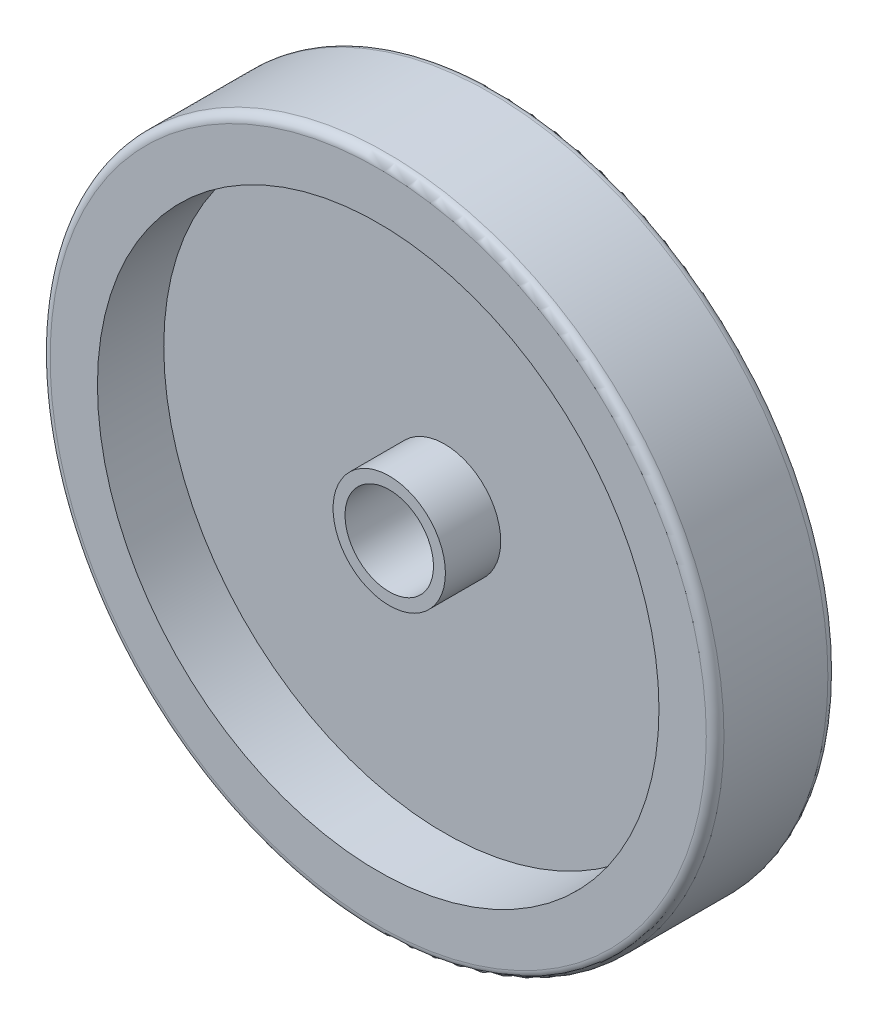
ISO-10303-21;
HEADER;
FILE_DESCRIPTION(('STEP AP214'),'2;1');
FILE_NAME('part.step','',(''),(''),'','','');
FILE_SCHEMA(('AUTOMOTIVE_DESIGN { 1 0 10303 214 1 1 1 1 }'));
ENDSEC;
DATA;
#1=APPLICATION_CONTEXT('core data for automotive mechanical design processes');
#2=APPLICATION_PROTOCOL_DEFINITION('international standard','automotive_design',2000,#1);
#3=PRODUCT_CONTEXT('',#1,'mechanical');
#4=PRODUCT('Part','Part','',(#3));
#5=PRODUCT_RELATED_PRODUCT_CATEGORY('part','',(#4));
#6=PRODUCT_DEFINITION_FORMATION('','',#4);
#7=PRODUCT_DEFINITION_CONTEXT('part definition',#1,'design');
#8=PRODUCT_DEFINITION('design','',#6,#7);
#9=PRODUCT_DEFINITION_SHAPE('','',#8);
#10=(LENGTH_UNIT() NAMED_UNIT(*) SI_UNIT(.MILLI.,.METRE.));
#11=(NAMED_UNIT(*) PLANE_ANGLE_UNIT() SI_UNIT($,.RADIAN.));
#12=(NAMED_UNIT(*) SI_UNIT($,.STERADIAN.) SOLID_ANGLE_UNIT());
#13=UNCERTAINTY_MEASURE_WITH_UNIT(LENGTH_MEASURE(1.E-05),#10,'distance_accuracy_value','');
#14=(GEOMETRIC_REPRESENTATION_CONTEXT(3) GLOBAL_UNCERTAINTY_ASSIGNED_CONTEXT((#13)) GLOBAL_UNIT_ASSIGNED_CONTEXT((#10,
#11,#12)) REPRESENTATION_CONTEXT('',''));
#15=CARTESIAN_POINT('',(0.,0.,0.));
#16=DIRECTION('',(0.,0.,1.));
#17=DIRECTION('',(1.,0.,0.));
#18=AXIS2_PLACEMENT_3D('',#15,#16,#17);
#19=CARTESIAN_POINT('',(0.,0.,12.5));
#20=DIRECTION('',(0.,0.,1.));
#21=DIRECTION('',(1.,0.,0.));
#22=AXIS2_PLACEMENT_3D('',#19,#20,#21);
#23=PLANE('',#22);
#24=CARTESIAN_POINT('',(0.,0.,12.5));
#25=DIRECTION('',(0.,0.,1.));
#26=DIRECTION('',(1.,0.,0.));
#27=AXIS2_PLACEMENT_3D('',#24,#25,#26);
#28=CIRCLE('',#27,12.7);
#29=CARTESIAN_POINT('',(12.7,0.,12.5));
#30=VERTEX_POINT('',#29);
#31=EDGE_CURVE('E75',#30,#30,#28,.T.);
#32=ORIENTED_EDGE('',*,*,#31,.F.);
#33=EDGE_LOOP('',(#32));
#34=FACE_BOUND('',#33,.T.);
#35=CARTESIAN_POINT('',(0.,0.,12.5));
#36=DIRECTION('',(0.,0.,1.));
#37=DIRECTION('',(1.,0.,0.));
#38=AXIS2_PLACEMENT_3D('',#35,#36,#37);
#39=CIRCLE('',#38,63.5);
#40=CARTESIAN_POINT('',(63.5,0.,12.5));
#41=VERTEX_POINT('',#40);
#42=EDGE_CURVE('E65',#41,#41,#39,.F.);
#43=ORIENTED_EDGE('',*,*,#42,.F.);
#44=EDGE_LOOP('',(#43));
#45=FACE_BOUND('',#44,.T.);
#46=ADVANCED_FACE('F41',(#34,#45),#23,.T.);
#47=CARTESIAN_POINT('',(0.,0.,25.));
#48=DIRECTION('',(0.,0.,-1.));
#49=DIRECTION('',(-1.,0.,0.));
#50=AXIS2_PLACEMENT_3D('',#47,#48,#49);
#51=CYLINDRICAL_SURFACE('',#50,76.2);
#52=CARTESIAN_POINT('',(0.,0.,25.5));
#53=DIRECTION('',(0.,0.,1.));
#54=DIRECTION('',(1.,0.,0.));
#55=AXIS2_PLACEMENT_3D('',#52,#53,#54);
#56=CIRCLE('',#55,76.2);
#57=CARTESIAN_POINT('',(76.2,0.,25.5));
#58=VERTEX_POINT('',#57);
#59=EDGE_CURVE('E49',#58,#58,#56,.F.);
#60=ORIENTED_EDGE('',*,*,#59,.T.);
#61=EDGE_LOOP('',(#60));
#62=FACE_BOUND('',#61,.T.);
#63=CARTESIAN_POINT('',(0.,0.,2.));
#64=DIRECTION('',(0.,0.,1.));
#65=DIRECTION('',(1.,0.,0.));
#66=AXIS2_PLACEMENT_3D('',#63,#64,#65);
#67=CIRCLE('',#66,76.2);
#68=CARTESIAN_POINT('',(76.2,0.,2.));
#69=VERTEX_POINT('',#68);
#70=EDGE_CURVE('E54',#69,#69,#67,.T.);
#71=ORIENTED_EDGE('',*,*,#70,.T.);
#72=EDGE_LOOP('',(#71));
#73=FACE_BOUND('',#72,.T.);
#74=ADVANCED_FACE('F109',(#62,#73),#51,.T.);
#75=CARTESIAN_POINT('',(0.,0.,25.));
#76=DIRECTION('',(0.,0.,1.));
#77=DIRECTION('',(1.,0.,0.));
#78=AXIS2_PLACEMENT_3D('',#75,#76,#77);
#79=PLANE('',#78);
#80=CARTESIAN_POINT('',(0.,0.,25.));
#81=DIRECTION('',(0.,0.,1.));
#82=DIRECTION('',(1.,0.,0.));
#83=AXIS2_PLACEMENT_3D('',#80,#81,#82);
#84=CIRCLE('',#83,10.);
#85=CARTESIAN_POINT('',(10.,0.,25.));
#86=VERTEX_POINT('',#85);
#87=EDGE_CURVE('E69',#86,#86,#84,.T.);
#88=ORIENTED_EDGE('',*,*,#87,.F.);
#89=EDGE_LOOP('',(#88));
#90=FACE_BOUND('',#89,.T.);
#91=CARTESIAN_POINT('',(0.,0.,25.));
#92=DIRECTION('',(0.,0.,1.));
#93=DIRECTION('',(1.,0.,0.));
#94=AXIS2_PLACEMENT_3D('',#91,#92,#93);
#95=CIRCLE('',#94,12.7);
#96=CARTESIAN_POINT('',(12.7,0.,25.));
#97=VERTEX_POINT('',#96);
#98=EDGE_CURVE('E70',#97,#97,#95,.T.);
#99=ORIENTED_EDGE('',*,*,#98,.T.);
#100=EDGE_LOOP('',(#99));
#101=FACE_BOUND('',#100,.T.);
#102=ADVANCED_FACE('F114',(#90,#101),#79,.T.);
#103=CARTESIAN_POINT('',(0.,0.,25.));
#104=DIRECTION('',(0.,0.,-1.));
#105=DIRECTION('',(-1.,0.,0.));
#106=AXIS2_PLACEMENT_3D('',#103,#104,#105);
#107=CYLINDRICAL_SURFACE('',#106,10.);
#108=ORIENTED_EDGE('',*,*,#87,.T.);
#109=EDGE_LOOP('',(#108));
#110=FACE_BOUND('',#109,.T.);
#111=CARTESIAN_POINT('',(0.,0.,0.));
#112=DIRECTION('',(0.,0.,1.));
#113=DIRECTION('',(1.,0.,0.));
#114=AXIS2_PLACEMENT_3D('',#111,#112,#113);
#115=CIRCLE('',#114,10.);
#116=CARTESIAN_POINT('',(10.,0.,0.));
#117=VERTEX_POINT('',#116);
#118=EDGE_CURVE('E74',#117,#117,#115,.T.);
#119=ORIENTED_EDGE('',*,*,#118,.F.);
#120=EDGE_LOOP('',(#119));
#121=FACE_BOUND('',#120,.T.);
#122=ADVANCED_FACE('F121',(#110,#121),#107,.F.);
#123=CARTESIAN_POINT('',(0.,0.,0.));
#124=DIRECTION('',(0.,0.,1.));
#125=DIRECTION('',(1.,0.,0.));
#126=AXIS2_PLACEMENT_3D('',#123,#124,#125);
#127=PLANE('',#126);
#128=CARTESIAN_POINT('',(0.,0.,0.));
#129=DIRECTION('',(0.,0.,1.));
#130=DIRECTION('',(1.,0.,0.));
#131=AXIS2_PLACEMENT_3D('',#128,#129,#130);
#132=CIRCLE('',#131,74.2);
#133=CARTESIAN_POINT('',(74.2,0.,0.));
#134=VERTEX_POINT('',#133);
#135=EDGE_CURVE('E10',#134,#134,#132,.F.);
#136=ORIENTED_EDGE('',*,*,#135,.T.);
#137=EDGE_LOOP('',(#136));
#138=FACE_BOUND('',#137,.T.);
#139=ORIENTED_EDGE('',*,*,#118,.T.);
#140=EDGE_LOOP('',(#139));
#141=FACE_BOUND('',#140,.T.);
#142=ADVANCED_FACE('F104',(#138,#141),#127,.F.);
#143=CARTESIAN_POINT('',(0.,0.,12.5));
#144=DIRECTION('',(0.,0.,1.));
#145=DIRECTION('',(1.,0.,0.));
#146=AXIS2_PLACEMENT_3D('',#143,#144,#145);
#147=CYLINDRICAL_SURFACE('',#146,12.7);
#148=ORIENTED_EDGE('',*,*,#98,.F.);
#149=EDGE_LOOP('',(#148));
#150=FACE_BOUND('',#149,.T.);
#151=ORIENTED_EDGE('',*,*,#31,.T.);
#152=EDGE_LOOP('',(#151));
#153=FACE_BOUND('',#152,.T.);
#154=ADVANCED_FACE('F95',(#150,#153),#147,.T.);
#155=CARTESIAN_POINT('',(0.,0.,27.5));
#156=DIRECTION('',(0.,0.,1.));
#157=DIRECTION('',(1.,0.,0.));
#158=AXIS2_PLACEMENT_3D('',#155,#156,#157);
#159=PLANE('',#158);
#160=CARTESIAN_POINT('',(0.,0.,27.5));
#161=DIRECTION('',(0.,0.,1.));
#162=DIRECTION('',(1.,0.,0.));
#163=AXIS2_PLACEMENT_3D('',#160,#161,#162);
#164=CIRCLE('',#163,74.2);
#165=CARTESIAN_POINT('',(74.2,0.,27.5));
#166=VERTEX_POINT('',#165);
#167=EDGE_CURVE('E59',#166,#166,#164,.T.);
#168=ORIENTED_EDGE('',*,*,#167,.T.);
#169=EDGE_LOOP('',(#168));
#170=FACE_BOUND('',#169,.T.);
#171=CARTESIAN_POINT('',(0.,0.,27.5));
#172=DIRECTION('',(0.,0.,1.));
#173=DIRECTION('',(1.,0.,0.));
#174=AXIS2_PLACEMENT_3D('',#171,#172,#173);
#175=CIRCLE('',#174,63.5);
#176=CARTESIAN_POINT('',(63.5,0.,27.5));
#177=VERTEX_POINT('',#176);
#178=EDGE_CURVE('E85',#177,#177,#175,.T.);
#179=ORIENTED_EDGE('',*,*,#178,.F.);
#180=EDGE_LOOP('',(#179));
#181=FACE_BOUND('',#180,.T.);
#182=ADVANCED_FACE('F93',(#170,#181),#159,.T.);
#183=CARTESIAN_POINT('',(0.,0.,27.5));
#184=DIRECTION('',(0.,0.,-1.));
#185=DIRECTION('',(-1.,0.,0.));
#186=AXIS2_PLACEMENT_3D('',#183,#184,#185);
#187=CYLINDRICAL_SURFACE('',#186,63.5);
#188=ORIENTED_EDGE('',*,*,#178,.T.);
#189=EDGE_LOOP('',(#188));
#190=FACE_BOUND('',#189,.T.);
#191=ORIENTED_EDGE('',*,*,#42,.T.);
#192=EDGE_LOOP('',(#191));
#193=FACE_BOUND('',#192,.T.);
#194=ADVANCED_FACE('F90',(#190,#193),#187,.F.);
#195=CARTESIAN_POINT('',(0.,0.,25.5));
#196=DIRECTION('',(0.,0.,1.));
#197=DIRECTION('',(1.,0.,0.));
#198=AXIS2_PLACEMENT_3D('',#195,#196,#197);
#199=TOROIDAL_SURFACE('',#198,74.2,2.);
#200=ORIENTED_EDGE('',*,*,#59,.F.);
#201=EDGE_LOOP('',(#200));
#202=FACE_BOUND('',#201,.T.);
#203=ORIENTED_EDGE('',*,*,#167,.F.);
#204=EDGE_LOOP('',(#203));
#205=FACE_BOUND('',#204,.T.);
#206=ADVANCED_FACE('F102',(#202,#205),#199,.T.);
#207=CARTESIAN_POINT('',(0.,0.,2.));
#208=DIRECTION('',(0.,0.,1.));
#209=DIRECTION('',(1.,0.,0.));
#210=AXIS2_PLACEMENT_3D('',#207,#208,#209);
#211=TOROIDAL_SURFACE('',#210,74.2,2.);
#212=ORIENTED_EDGE('',*,*,#135,.F.);
#213=EDGE_LOOP('',(#212));
#214=FACE_BOUND('',#213,.T.);
#215=ORIENTED_EDGE('',*,*,#70,.F.);
#216=EDGE_LOOP('',(#215));
#217=FACE_BOUND('',#216,.T.);
#218=ADVANCED_FACE('F43',(#214,#217),#211,.T.);
#219=CLOSED_SHELL('',(#46,#74,#102,#122,#142,#154,#182,#194,#206,#218));
#220=MANIFOLD_SOLID_BREP('B2',#219);
#221=ADVANCED_BREP_SHAPE_REPRESENTATION('',(#18,#220),#14);
#222=SHAPE_DEFINITION_REPRESENTATION(#9,#221);
ENDSEC;
END-ISO-10303-21;
